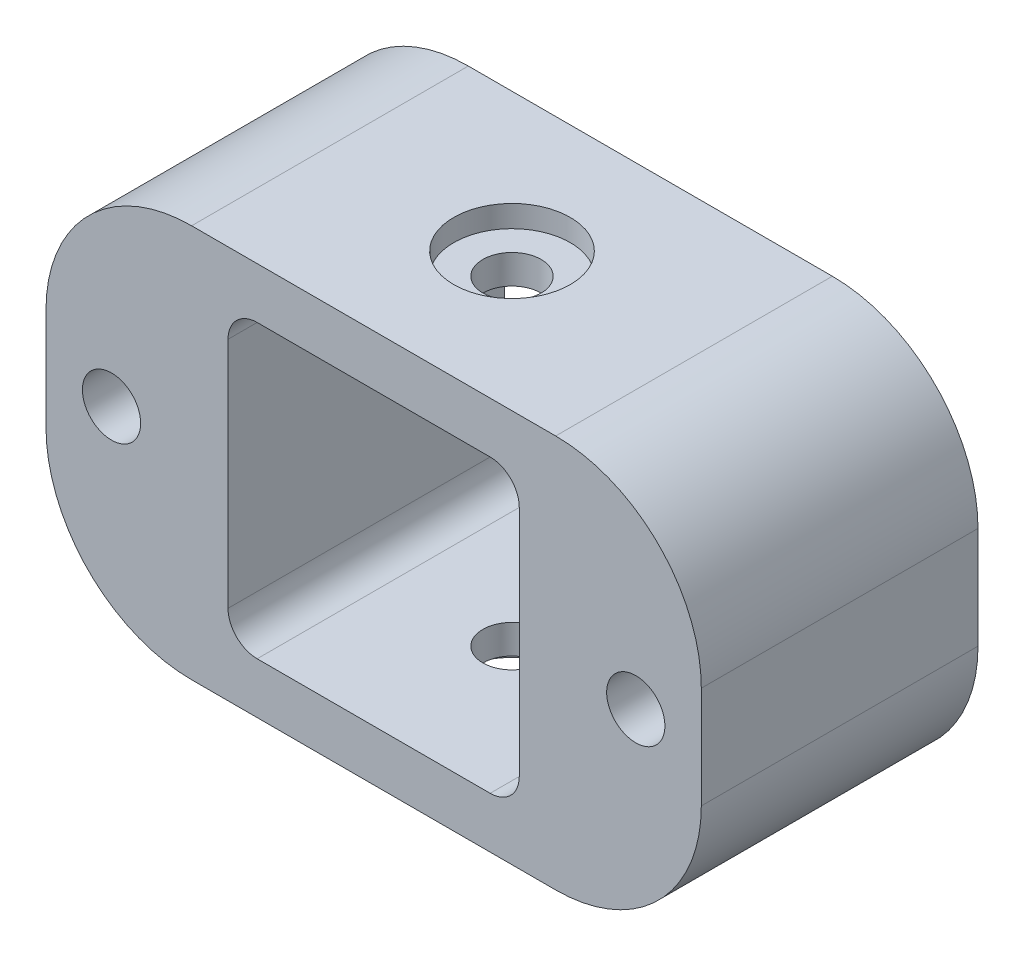
ISO-10303-21;
HEADER;
FILE_DESCRIPTION(('STEP AP214'),'2;1');
FILE_NAME('part.step','',(''),(''),'','','');
FILE_SCHEMA(('AUTOMOTIVE_DESIGN { 1 0 10303 214 1 1 1 1 }'));
ENDSEC;
DATA;
#1=APPLICATION_CONTEXT('core data for automotive mechanical design processes');
#2=APPLICATION_PROTOCOL_DEFINITION('international standard','automotive_design',2000,#1);
#3=PRODUCT_CONTEXT('',#1,'mechanical');
#4=PRODUCT('Part','Part','',(#3));
#5=PRODUCT_RELATED_PRODUCT_CATEGORY('part','',(#4));
#6=PRODUCT_DEFINITION_FORMATION('','',#4);
#7=PRODUCT_DEFINITION_CONTEXT('part definition',#1,'design');
#8=PRODUCT_DEFINITION('design','',#6,#7);
#9=PRODUCT_DEFINITION_SHAPE('','',#8);
#10=(LENGTH_UNIT() NAMED_UNIT(*) SI_UNIT(.MILLI.,.METRE.));
#11=(NAMED_UNIT(*) PLANE_ANGLE_UNIT() SI_UNIT($,.RADIAN.));
#12=(NAMED_UNIT(*) SI_UNIT($,.STERADIAN.) SOLID_ANGLE_UNIT());
#13=UNCERTAINTY_MEASURE_WITH_UNIT(LENGTH_MEASURE(1.E-05),#10,'distance_accuracy_value','');
#14=(GEOMETRIC_REPRESENTATION_CONTEXT(3) GLOBAL_UNCERTAINTY_ASSIGNED_CONTEXT((#13)) GLOBAL_UNIT_ASSIGNED_CONTEXT((#10,
#11,#12)) REPRESENTATION_CONTEXT('',''));
#15=CARTESIAN_POINT('',(0.,0.,0.));
#16=DIRECTION('',(0.,0.,1.));
#17=DIRECTION('',(1.,0.,0.));
#18=AXIS2_PLACEMENT_3D('',#15,#16,#17);
#19=CARTESIAN_POINT('',(0.,-13.5,9.5));
#20=DIRECTION('',(0.,1.,0.));
#21=DIRECTION('',(0.,0.,1.));
#22=AXIS2_PLACEMENT_3D('',#19,#20,#21);
#23=CYLINDRICAL_SURFACE('',#22,2.);
#24=CARTESIAN_POINT('',(0.,-10.,9.5));
#25=DIRECTION('',(0.,1.,0.));
#26=DIRECTION('',(0.,0.,1.));
#27=AXIS2_PLACEMENT_3D('',#24,#25,#26);
#28=CIRCLE('',#27,2.);
#29=CARTESIAN_POINT('',(0.,-10.,11.5));
#30=VERTEX_POINT('',#29);
#31=EDGE_CURVE('E272',#30,#30,#28,.T.);
#32=ORIENTED_EDGE('',*,*,#31,.T.);
#33=EDGE_LOOP('',(#32));
#34=FACE_BOUND('',#33,.T.);
#35=CARTESIAN_POINT('',(0.,-12.,9.5));
#36=DIRECTION('',(0.,-1.,0.));
#37=DIRECTION('',(0.,0.,-1.));
#38=AXIS2_PLACEMENT_3D('',#35,#36,#37);
#39=CIRCLE('',#38,2.);
#40=CARTESIAN_POINT('',(0.,-12.,7.5));
#41=VERTEX_POINT('',#40);
#42=EDGE_CURVE('E37',#41,#41,#39,.F.);
#43=ORIENTED_EDGE('',*,*,#42,.F.);
#44=EDGE_LOOP('',(#43));
#45=FACE_BOUND('',#44,.T.);
#46=ADVANCED_FACE('F33',(#34,#45),#23,.F.);
#47=CARTESIAN_POINT('',(0.,9.99999999999999,9.5));
#48=DIRECTION('',(0.,-1.,0.));
#49=DIRECTION('',(0.,0.,-1.));
#50=AXIS2_PLACEMENT_3D('',#47,#48,#49);
#51=CIRCLE('',#50,2.);
#52=CARTESIAN_POINT('',(0.,9.99999999999999,7.5));
#53=VERTEX_POINT('',#52);
#54=EDGE_CURVE('E270',#53,#53,#51,.T.);
#55=ORIENTED_EDGE('',*,*,#54,.T.);
#56=EDGE_LOOP('',(#55));
#57=FACE_BOUND('',#56,.T.);
#58=CARTESIAN_POINT('',(0.,12.,9.5));
#59=DIRECTION('',(0.,1.,0.));
#60=DIRECTION('',(0.,0.,1.));
#61=AXIS2_PLACEMENT_3D('',#58,#59,#60);
#62=CIRCLE('',#61,2.);
#63=CARTESIAN_POINT('',(0.,12.,11.5));
#64=VERTEX_POINT('',#63);
#65=EDGE_CURVE('E273',#64,#64,#62,.F.);
#66=ORIENTED_EDGE('',*,*,#65,.F.);
#67=EDGE_LOOP('',(#66));
#68=FACE_BOUND('',#67,.T.);
#69=ADVANCED_FACE('F321',(#57,#68),#23,.F.);
#70=CARTESIAN_POINT('',(12.5,3.5,19.));
#71=DIRECTION('',(0.,0.,-1.));
#72=DIRECTION('',(-1.,0.,0.));
#73=AXIS2_PLACEMENT_3D('',#70,#71,#72);
#74=PLANE('',#73);
#75=CARTESIAN_POINT('',(12.5,3.5,19.));
#76=DIRECTION('',(0.,0.,1.));
#77=DIRECTION('',(-1.,0.,0.));
#78=AXIS2_PLACEMENT_3D('',#75,#76,#77);
#79=CIRCLE('',#78,10.);
#80=CARTESIAN_POINT('',(22.5,3.49999999999993,19.));
#81=VERTEX_POINT('',#80);
#82=CARTESIAN_POINT('',(12.4999999999999,13.5,19.));
#83=VERTEX_POINT('',#82);
#84=EDGE_CURVE('E217',#81,#83,#79,.T.);
#85=ORIENTED_EDGE('',*,*,#84,.T.);
#86=DIRECTION('',(-1.,0.,0.));
#87=VECTOR('',#86,1.);
#88=CARTESIAN_POINT('',(-12.4999999999999,13.5,19.));
#89=LINE('',#88,#87);
#90=CARTESIAN_POINT('',(-12.4999999999999,13.5,19.));
#91=VERTEX_POINT('',#90);
#92=EDGE_CURVE('E220',#83,#91,#89,.T.);
#93=ORIENTED_EDGE('',*,*,#92,.T.);
#94=CARTESIAN_POINT('',(-12.5,3.5,19.));
#95=DIRECTION('',(0.,0.,1.));
#96=DIRECTION('',(-1.,0.,0.));
#97=AXIS2_PLACEMENT_3D('',#94,#95,#96);
#98=CIRCLE('',#97,10.);
#99=CARTESIAN_POINT('',(-22.5,3.49999999999993,19.));
#100=VERTEX_POINT('',#99);
#101=EDGE_CURVE('E223',#91,#100,#98,.T.);
#102=ORIENTED_EDGE('',*,*,#101,.T.);
#103=DIRECTION('',(0.,-1.,0.));
#104=VECTOR('',#103,1.);
#105=CARTESIAN_POINT('',(-22.5,-3.49999999999993,19.));
#106=LINE('',#105,#104);
#107=CARTESIAN_POINT('',(-22.5,-3.49999999999993,19.));
#108=VERTEX_POINT('',#107);
#109=EDGE_CURVE('E225',#100,#108,#106,.T.);
#110=ORIENTED_EDGE('',*,*,#109,.T.);
#111=CARTESIAN_POINT('',(-12.5,-3.5,19.));
#112=DIRECTION('',(0.,0.,1.));
#113=DIRECTION('',(-1.,0.,0.));
#114=AXIS2_PLACEMENT_3D('',#111,#112,#113);
#115=CIRCLE('',#114,10.);
#116=CARTESIAN_POINT('',(-12.4999999999999,-13.5,19.));
#117=VERTEX_POINT('',#116);
#118=EDGE_CURVE('E227',#108,#117,#115,.T.);
#119=ORIENTED_EDGE('',*,*,#118,.T.);
#120=DIRECTION('',(1.,0.,0.));
#121=VECTOR('',#120,1.);
#122=CARTESIAN_POINT('',(-12.4999999999999,-13.5,19.));
#123=LINE('',#122,#121);
#124=CARTESIAN_POINT('',(12.4999999999999,-13.5,19.));
#125=VERTEX_POINT('',#124);
#126=EDGE_CURVE('E229',#117,#125,#123,.T.);
#127=ORIENTED_EDGE('',*,*,#126,.T.);
#128=CARTESIAN_POINT('',(12.5,-3.5,19.));
#129=DIRECTION('',(0.,0.,1.));
#130=DIRECTION('',(-1.,0.,0.));
#131=AXIS2_PLACEMENT_3D('',#128,#129,#130);
#132=CIRCLE('',#131,10.);
#133=CARTESIAN_POINT('',(22.5,-3.49999999999993,19.));
#134=VERTEX_POINT('',#133);
#135=EDGE_CURVE('E231',#125,#134,#132,.T.);
#136=ORIENTED_EDGE('',*,*,#135,.T.);
#137=DIRECTION('',(0.,1.,0.));
#138=VECTOR('',#137,1.);
#139=CARTESIAN_POINT('',(22.5,-3.49999999999993,19.));
#140=LINE('',#139,#138);
#141=EDGE_CURVE('E233',#134,#81,#140,.T.);
#142=ORIENTED_EDGE('',*,*,#141,.T.);
#143=EDGE_LOOP('',(#85,#93,#102,#110,#119,#127,#136,#142));
#144=FACE_BOUND('',#143,.T.);
#145=CARTESIAN_POINT('',(-8.,-8.00000000000001,19.));
#146=DIRECTION('',(0.,0.,1.));
#147=DIRECTION('',(1.,0.,0.));
#148=AXIS2_PLACEMENT_3D('',#145,#146,#147);
#149=CIRCLE('',#148,2.);
#150=CARTESIAN_POINT('',(-10.,-8.00000000000001,19.));
#151=VERTEX_POINT('',#150);
#152=CARTESIAN_POINT('',(-8.,-10.,19.));
#153=VERTEX_POINT('',#152);
#154=EDGE_CURVE('E148',#151,#153,#149,.T.);
#155=ORIENTED_EDGE('',*,*,#154,.F.);
#156=DIRECTION('',(0.,-1.,0.));
#157=VECTOR('',#156,1.);
#158=CARTESIAN_POINT('',(-10.,-8.00000000000001,19.));
#159=LINE('',#158,#157);
#160=CARTESIAN_POINT('',(-10.,7.99999999999999,19.));
#161=VERTEX_POINT('',#160);
#162=EDGE_CURVE('E184',#161,#151,#159,.T.);
#163=ORIENTED_EDGE('',*,*,#162,.F.);
#164=CARTESIAN_POINT('',(-8.,7.99999999999999,19.));
#165=DIRECTION('',(0.,0.,1.));
#166=DIRECTION('',(1.,0.,0.));
#167=AXIS2_PLACEMENT_3D('',#164,#165,#166);
#168=CIRCLE('',#167,2.);
#169=CARTESIAN_POINT('',(-8.,9.99999999999999,19.));
#170=VERTEX_POINT('',#169);
#171=EDGE_CURVE('E182',#170,#161,#168,.T.);
#172=ORIENTED_EDGE('',*,*,#171,.F.);
#173=DIRECTION('',(-1.,0.,0.));
#174=VECTOR('',#173,1.);
#175=CARTESIAN_POINT('',(-8.,9.99999999999999,19.));
#176=LINE('',#175,#174);
#177=CARTESIAN_POINT('',(8.,9.99999999999999,19.));
#178=VERTEX_POINT('',#177);
#179=EDGE_CURVE('E180',#178,#170,#176,.T.);
#180=ORIENTED_EDGE('',*,*,#179,.F.);
#181=CARTESIAN_POINT('',(8.,7.99999999999999,19.));
#182=DIRECTION('',(0.,0.,1.));
#183=DIRECTION('',(1.,0.,0.));
#184=AXIS2_PLACEMENT_3D('',#181,#182,#183);
#185=CIRCLE('',#184,2.);
#186=CARTESIAN_POINT('',(10.,7.99999999999999,19.));
#187=VERTEX_POINT('',#186);
#188=EDGE_CURVE('E178',#187,#178,#185,.T.);
#189=ORIENTED_EDGE('',*,*,#188,.F.);
#190=DIRECTION('',(0.,1.,0.));
#191=VECTOR('',#190,1.);
#192=CARTESIAN_POINT('',(10.,-8.00000000000001,19.));
#193=LINE('',#192,#191);
#194=CARTESIAN_POINT('',(10.,-8.00000000000001,19.));
#195=VERTEX_POINT('',#194);
#196=EDGE_CURVE('E173',#195,#187,#193,.T.);
#197=ORIENTED_EDGE('',*,*,#196,.F.);
#198=CARTESIAN_POINT('',(8.,-8.00000000000001,19.));
#199=DIRECTION('',(0.,0.,1.));
#200=DIRECTION('',(1.,0.,0.));
#201=AXIS2_PLACEMENT_3D('',#198,#199,#200);
#202=CIRCLE('',#201,2.);
#203=CARTESIAN_POINT('',(8.,-10.,19.));
#204=VERTEX_POINT('',#203);
#205=EDGE_CURVE('E171',#204,#195,#202,.T.);
#206=ORIENTED_EDGE('',*,*,#205,.F.);
#207=DIRECTION('',(1.,0.,0.));
#208=VECTOR('',#207,1.);
#209=CARTESIAN_POINT('',(-8.,-10.,19.));
#210=LINE('',#209,#208);
#211=EDGE_CURVE('E156',#153,#204,#210,.T.);
#212=ORIENTED_EDGE('',*,*,#211,.F.);
#213=EDGE_LOOP('',(#155,#163,#172,#180,#189,#197,#206,#212));
#214=FACE_BOUND('',#213,.T.);
#215=CARTESIAN_POINT('',(-18.,0.,19.));
#216=DIRECTION('',(0.,0.,1.));
#217=DIRECTION('',(1.,0.,0.));
#218=AXIS2_PLACEMENT_3D('',#215,#216,#217);
#219=CIRCLE('',#218,2.);
#220=CARTESIAN_POINT('',(-16.,0.,19.));
#221=VERTEX_POINT('',#220);
#222=EDGE_CURVE('E187',#221,#221,#219,.T.);
#223=ORIENTED_EDGE('',*,*,#222,.F.);
#224=EDGE_LOOP('',(#223));
#225=FACE_BOUND('',#224,.T.);
#226=CARTESIAN_POINT('',(18.,0.,19.));
#227=DIRECTION('',(0.,0.,1.));
#228=DIRECTION('',(1.,0.,0.));
#229=AXIS2_PLACEMENT_3D('',#226,#227,#228);
#230=CIRCLE('',#229,2.);
#231=CARTESIAN_POINT('',(20.,0.,19.));
#232=VERTEX_POINT('',#231);
#233=EDGE_CURVE('E292',#232,#232,#230,.T.);
#234=ORIENTED_EDGE('',*,*,#233,.F.);
#235=EDGE_LOOP('',(#234));
#236=FACE_BOUND('',#235,.T.);
#237=ADVANCED_FACE('F168',(#144,#214,#225,#236),#74,.F.);
#238=CARTESIAN_POINT('',(12.5,3.5,0.));
#239=DIRECTION('',(0.,0.,-1.));
#240=DIRECTION('',(-1.,0.,0.));
#241=AXIS2_PLACEMENT_3D('',#238,#239,#240);
#242=PLANE('',#241);
#243=CARTESIAN_POINT('',(-18.,0.,0.));
#244=DIRECTION('',(0.,0.,1.));
#245=DIRECTION('',(1.,0.,0.));
#246=AXIS2_PLACEMENT_3D('',#243,#244,#245);
#247=CIRCLE('',#246,2.);
#248=CARTESIAN_POINT('',(-16.,0.,0.));
#249=VERTEX_POINT('',#248);
#250=EDGE_CURVE('E295',#249,#249,#247,.T.);
#251=ORIENTED_EDGE('',*,*,#250,.T.);
#252=EDGE_LOOP('',(#251));
#253=FACE_BOUND('',#252,.T.);
#254=CARTESIAN_POINT('',(12.5,3.5,0.));
#255=DIRECTION('',(0.,0.,1.));
#256=DIRECTION('',(-1.,0.,0.));
#257=AXIS2_PLACEMENT_3D('',#254,#255,#256);
#258=CIRCLE('',#257,10.);
#259=CARTESIAN_POINT('',(22.5,3.49999999999993,0.));
#260=VERTEX_POINT('',#259);
#261=CARTESIAN_POINT('',(12.4999999999999,13.5,0.));
#262=VERTEX_POINT('',#261);
#263=EDGE_CURVE('E164',#260,#262,#258,.T.);
#264=ORIENTED_EDGE('',*,*,#263,.F.);
#265=DIRECTION('',(0.,1.,0.));
#266=VECTOR('',#265,1.);
#267=CARTESIAN_POINT('',(22.5,-3.49999999999993,0.));
#268=LINE('',#267,#266);
#269=CARTESIAN_POINT('',(22.5,-3.49999999999993,0.));
#270=VERTEX_POINT('',#269);
#271=EDGE_CURVE('E221',#270,#260,#268,.T.);
#272=ORIENTED_EDGE('',*,*,#271,.F.);
#273=CARTESIAN_POINT('',(12.5,-3.5,0.));
#274=DIRECTION('',(0.,0.,1.));
#275=DIRECTION('',(-1.,0.,0.));
#276=AXIS2_PLACEMENT_3D('',#273,#274,#275);
#277=CIRCLE('',#276,10.);
#278=CARTESIAN_POINT('',(12.4999999999999,-13.5,0.));
#279=VERTEX_POINT('',#278);
#280=EDGE_CURVE('E248',#279,#270,#277,.T.);
#281=ORIENTED_EDGE('',*,*,#280,.F.);
#282=DIRECTION('',(1.,0.,0.));
#283=VECTOR('',#282,1.);
#284=CARTESIAN_POINT('',(-12.4999999999999,-13.5,0.));
#285=LINE('',#284,#283);
#286=CARTESIAN_POINT('',(-12.4999999999999,-13.5,0.));
#287=VERTEX_POINT('',#286);
#288=EDGE_CURVE('E246',#287,#279,#285,.T.);
#289=ORIENTED_EDGE('',*,*,#288,.F.);
#290=CARTESIAN_POINT('',(-12.5,-3.5,0.));
#291=DIRECTION('',(0.,0.,1.));
#292=DIRECTION('',(-1.,0.,0.));
#293=AXIS2_PLACEMENT_3D('',#290,#291,#292);
#294=CIRCLE('',#293,10.);
#295=CARTESIAN_POINT('',(-22.5,-3.49999999999993,0.));
#296=VERTEX_POINT('',#295);
#297=EDGE_CURVE('E244',#296,#287,#294,.T.);
#298=ORIENTED_EDGE('',*,*,#297,.F.);
#299=DIRECTION('',(0.,-1.,0.));
#300=VECTOR('',#299,1.);
#301=CARTESIAN_POINT('',(-22.5,-3.49999999999993,0.));
#302=LINE('',#301,#300);
#303=CARTESIAN_POINT('',(-22.5,3.49999999999993,0.));
#304=VERTEX_POINT('',#303);
#305=EDGE_CURVE('E242',#304,#296,#302,.T.);
#306=ORIENTED_EDGE('',*,*,#305,.F.);
#307=CARTESIAN_POINT('',(-12.5,3.5,0.));
#308=DIRECTION('',(0.,0.,1.));
#309=DIRECTION('',(-1.,0.,0.));
#310=AXIS2_PLACEMENT_3D('',#307,#308,#309);
#311=CIRCLE('',#310,10.);
#312=CARTESIAN_POINT('',(-12.4999999999999,13.5,0.));
#313=VERTEX_POINT('',#312);
#314=EDGE_CURVE('E240',#313,#304,#311,.T.);
#315=ORIENTED_EDGE('',*,*,#314,.F.);
#316=DIRECTION('',(-1.,0.,0.));
#317=VECTOR('',#316,1.);
#318=CARTESIAN_POINT('',(-12.4999999999999,13.5,0.));
#319=LINE('',#318,#317);
#320=EDGE_CURVE('E238',#262,#313,#319,.T.);
#321=ORIENTED_EDGE('',*,*,#320,.F.);
#322=EDGE_LOOP('',(#264,#272,#281,#289,#298,#306,#315,#321));
#323=FACE_BOUND('',#322,.T.);
#324=DIRECTION('',(0.,-1.,0.));
#325=VECTOR('',#324,1.);
#326=CARTESIAN_POINT('',(-10.,-8.00000000000001,0.));
#327=LINE('',#326,#325);
#328=CARTESIAN_POINT('',(-10.,7.99999999999999,0.));
#329=VERTEX_POINT('',#328);
#330=CARTESIAN_POINT('',(-10.,-8.00000000000001,0.));
#331=VERTEX_POINT('',#330);
#332=EDGE_CURVE('E157',#329,#331,#327,.T.);
#333=ORIENTED_EDGE('',*,*,#332,.T.);
#334=CARTESIAN_POINT('',(-8.,-8.00000000000001,0.));
#335=DIRECTION('',(0.,0.,1.));
#336=DIRECTION('',(1.,0.,0.));
#337=AXIS2_PLACEMENT_3D('',#334,#335,#336);
#338=CIRCLE('',#337,2.);
#339=CARTESIAN_POINT('',(-8.,-10.,0.));
#340=VERTEX_POINT('',#339);
#341=EDGE_CURVE('E58',#331,#340,#338,.T.);
#342=ORIENTED_EDGE('',*,*,#341,.T.);
#343=DIRECTION('',(1.,0.,0.));
#344=VECTOR('',#343,1.);
#345=CARTESIAN_POINT('',(-8.,-10.,0.));
#346=LINE('',#345,#344);
#347=CARTESIAN_POINT('',(8.,-10.,0.));
#348=VERTEX_POINT('',#347);
#349=EDGE_CURVE('E163',#340,#348,#346,.T.);
#350=ORIENTED_EDGE('',*,*,#349,.T.);
#351=CARTESIAN_POINT('',(8.,-8.00000000000001,0.));
#352=DIRECTION('',(0.,0.,1.));
#353=DIRECTION('',(1.,0.,0.));
#354=AXIS2_PLACEMENT_3D('',#351,#352,#353);
#355=CIRCLE('',#354,2.);
#356=CARTESIAN_POINT('',(10.,-8.00000000000001,0.));
#357=VERTEX_POINT('',#356);
#358=EDGE_CURVE('E189',#348,#357,#355,.T.);
#359=ORIENTED_EDGE('',*,*,#358,.T.);
#360=DIRECTION('',(0.,1.,0.));
#361=VECTOR('',#360,1.);
#362=CARTESIAN_POINT('',(10.,-8.00000000000001,0.));
#363=LINE('',#362,#361);
#364=CARTESIAN_POINT('',(10.,7.99999999999999,0.));
#365=VERTEX_POINT('',#364);
#366=EDGE_CURVE('E192',#357,#365,#363,.T.);
#367=ORIENTED_EDGE('',*,*,#366,.T.);
#368=CARTESIAN_POINT('',(8.,7.99999999999999,0.));
#369=DIRECTION('',(0.,0.,1.));
#370=DIRECTION('',(1.,0.,0.));
#371=AXIS2_PLACEMENT_3D('',#368,#369,#370);
#372=CIRCLE('',#371,2.);
#373=CARTESIAN_POINT('',(8.,9.99999999999999,0.));
#374=VERTEX_POINT('',#373);
#375=EDGE_CURVE('E195',#365,#374,#372,.T.);
#376=ORIENTED_EDGE('',*,*,#375,.T.);
#377=DIRECTION('',(-1.,0.,0.));
#378=VECTOR('',#377,1.);
#379=CARTESIAN_POINT('',(-8.,9.99999999999999,0.));
#380=LINE('',#379,#378);
#381=CARTESIAN_POINT('',(-8.,9.99999999999999,0.));
#382=VERTEX_POINT('',#381);
#383=EDGE_CURVE('E198',#374,#382,#380,.T.);
#384=ORIENTED_EDGE('',*,*,#383,.T.);
#385=CARTESIAN_POINT('',(-8.,7.99999999999999,0.));
#386=DIRECTION('',(0.,0.,1.));
#387=DIRECTION('',(1.,0.,0.));
#388=AXIS2_PLACEMENT_3D('',#385,#386,#387);
#389=CIRCLE('',#388,2.);
#390=EDGE_CURVE('E201',#382,#329,#389,.T.);
#391=ORIENTED_EDGE('',*,*,#390,.T.);
#392=EDGE_LOOP('',(#333,#342,#350,#359,#367,#376,#384,#391));
#393=FACE_BOUND('',#392,.T.);
#394=CARTESIAN_POINT('',(18.,0.,0.));
#395=DIRECTION('',(0.,0.,1.));
#396=DIRECTION('',(1.,0.,0.));
#397=AXIS2_PLACEMENT_3D('',#394,#395,#396);
#398=CIRCLE('',#397,2.);
#399=CARTESIAN_POINT('',(20.,0.,0.));
#400=VERTEX_POINT('',#399);
#401=EDGE_CURVE('E291',#400,#400,#398,.T.);
#402=ORIENTED_EDGE('',*,*,#401,.T.);
#403=EDGE_LOOP('',(#402));
#404=FACE_BOUND('',#403,.T.);
#405=ADVANCED_FACE('F302',(#253,#323,#393,#404),#242,.T.);
#406=CARTESIAN_POINT('',(12.5,3.5,19.));
#407=DIRECTION('',(0.,0.,-1.));
#408=DIRECTION('',(-1.,0.,0.));
#409=AXIS2_PLACEMENT_3D('',#406,#407,#408);
#410=CYLINDRICAL_SURFACE('',#409,10.);
#411=ORIENTED_EDGE('',*,*,#263,.T.);
#412=DIRECTION('',(0.,0.,-1.));
#413=VECTOR('',#412,1.);
#414=CARTESIAN_POINT('',(12.4999999999999,13.5,19.));
#415=LINE('',#414,#413);
#416=EDGE_CURVE('E11',#83,#262,#415,.T.);
#417=ORIENTED_EDGE('',*,*,#416,.F.);
#418=ORIENTED_EDGE('',*,*,#84,.F.);
#419=DIRECTION('',(0.,0.,-1.));
#420=VECTOR('',#419,1.);
#421=CARTESIAN_POINT('',(22.5,3.49999999999993,19.));
#422=LINE('',#421,#420);
#423=EDGE_CURVE('E235',#81,#260,#422,.T.);
#424=ORIENTED_EDGE('',*,*,#423,.T.);
#425=EDGE_LOOP('',(#411,#417,#418,#424));
#426=FACE_BOUND('',#425,.T.);
#427=ADVANCED_FACE('F35',(#426),#410,.T.);
#428=CARTESIAN_POINT('',(-12.4999999999999,13.5,19.));
#429=DIRECTION('',(0.,-1.,0.));
#430=DIRECTION('',(0.,0.,-1.));
#431=AXIS2_PLACEMENT_3D('',#428,#429,#430);
#432=PLANE('',#431);
#433=CARTESIAN_POINT('',(0.,13.5,9.5));
#434=DIRECTION('',(0.,1.,0.));
#435=DIRECTION('',(0.,0.,1.));
#436=AXIS2_PLACEMENT_3D('',#433,#434,#435);
#437=CIRCLE('',#436,4.);
#438=CARTESIAN_POINT('',(0.,13.5,13.5));
#439=VERTEX_POINT('',#438);
#440=EDGE_CURVE('E279',#439,#439,#437,.T.);
#441=ORIENTED_EDGE('',*,*,#440,.F.);
#442=EDGE_LOOP('',(#441));
#443=FACE_BOUND('',#442,.T.);
#444=ORIENTED_EDGE('',*,*,#320,.T.);
#445=DIRECTION('',(0.,0.,-1.));
#446=VECTOR('',#445,1.);
#447=CARTESIAN_POINT('',(-12.4999999999999,13.5,19.));
#448=LINE('',#447,#446);
#449=EDGE_CURVE('E42',#91,#313,#448,.T.);
#450=ORIENTED_EDGE('',*,*,#449,.F.);
#451=ORIENTED_EDGE('',*,*,#92,.F.);
#452=ORIENTED_EDGE('',*,*,#416,.T.);
#453=EDGE_LOOP('',(#444,#450,#451,#452));
#454=FACE_BOUND('',#453,.T.);
#455=ADVANCED_FACE('F395',(#443,#454),#432,.F.);
#456=CARTESIAN_POINT('',(-12.5,3.5,19.));
#457=DIRECTION('',(0.,0.,-1.));
#458=DIRECTION('',(-1.,0.,0.));
#459=AXIS2_PLACEMENT_3D('',#456,#457,#458);
#460=CYLINDRICAL_SURFACE('',#459,10.);
#461=ORIENTED_EDGE('',*,*,#314,.T.);
#462=DIRECTION('',(0.,0.,-1.));
#463=VECTOR('',#462,1.);
#464=CARTESIAN_POINT('',(-22.5,3.49999999999993,19.));
#465=LINE('',#464,#463);
#466=EDGE_CURVE('E265',#100,#304,#465,.T.);
#467=ORIENTED_EDGE('',*,*,#466,.F.);
#468=ORIENTED_EDGE('',*,*,#101,.F.);
#469=ORIENTED_EDGE('',*,*,#449,.T.);
#470=EDGE_LOOP('',(#461,#467,#468,#469));
#471=FACE_BOUND('',#470,.T.);
#472=ADVANCED_FACE('F393',(#471),#460,.T.);
#473=CARTESIAN_POINT('',(-22.5,-3.49999999999993,19.));
#474=DIRECTION('',(1.,0.,0.));
#475=DIRECTION('',(0.,0.,-1.));
#476=AXIS2_PLACEMENT_3D('',#473,#474,#475);
#477=PLANE('',#476);
#478=ORIENTED_EDGE('',*,*,#305,.T.);
#479=DIRECTION('',(0.,0.,-1.));
#480=VECTOR('',#479,1.);
#481=CARTESIAN_POINT('',(-22.5,-3.49999999999993,19.));
#482=LINE('',#481,#480);
#483=EDGE_CURVE('E262',#108,#296,#482,.T.);
#484=ORIENTED_EDGE('',*,*,#483,.F.);
#485=ORIENTED_EDGE('',*,*,#109,.F.);
#486=ORIENTED_EDGE('',*,*,#466,.T.);
#487=EDGE_LOOP('',(#478,#484,#485,#486));
#488=FACE_BOUND('',#487,.T.);
#489=ADVANCED_FACE('F389',(#488),#477,.F.);
#490=CARTESIAN_POINT('',(-12.5,-3.5,19.));
#491=DIRECTION('',(0.,0.,-1.));
#492=DIRECTION('',(-1.,0.,0.));
#493=AXIS2_PLACEMENT_3D('',#490,#491,#492);
#494=CYLINDRICAL_SURFACE('',#493,10.);
#495=ORIENTED_EDGE('',*,*,#297,.T.);
#496=DIRECTION('',(0.,0.,-1.));
#497=VECTOR('',#496,1.);
#498=CARTESIAN_POINT('',(-12.4999999999999,-13.5,19.));
#499=LINE('',#498,#497);
#500=EDGE_CURVE('E259',#117,#287,#499,.T.);
#501=ORIENTED_EDGE('',*,*,#500,.F.);
#502=ORIENTED_EDGE('',*,*,#118,.F.);
#503=ORIENTED_EDGE('',*,*,#483,.T.);
#504=EDGE_LOOP('',(#495,#501,#502,#503));
#505=FACE_BOUND('',#504,.T.);
#506=ADVANCED_FACE('F359',(#505),#494,.T.);
#507=CARTESIAN_POINT('',(-12.4999999999999,-13.5,19.));
#508=DIRECTION('',(0.,1.,0.));
#509=DIRECTION('',(0.,0.,1.));
#510=AXIS2_PLACEMENT_3D('',#507,#508,#509);
#511=PLANE('',#510);
#512=CARTESIAN_POINT('',(0.,-13.5,9.5));
#513=DIRECTION('',(0.,-1.,0.));
#514=DIRECTION('',(0.,0.,-1.));
#515=AXIS2_PLACEMENT_3D('',#512,#513,#514);
#516=CIRCLE('',#515,4.);
#517=CARTESIAN_POINT('',(0.,-13.5,5.5));
#518=VERTEX_POINT('',#517);
#519=EDGE_CURVE('E286',#518,#518,#516,.T.);
#520=ORIENTED_EDGE('',*,*,#519,.F.);
#521=EDGE_LOOP('',(#520));
#522=FACE_BOUND('',#521,.T.);
#523=ORIENTED_EDGE('',*,*,#288,.T.);
#524=DIRECTION('',(0.,0.,-1.));
#525=VECTOR('',#524,1.);
#526=CARTESIAN_POINT('',(12.4999999999999,-13.5,19.));
#527=LINE('',#526,#525);
#528=EDGE_CURVE('E256',#125,#279,#527,.T.);
#529=ORIENTED_EDGE('',*,*,#528,.F.);
#530=ORIENTED_EDGE('',*,*,#126,.F.);
#531=ORIENTED_EDGE('',*,*,#500,.T.);
#532=EDGE_LOOP('',(#523,#529,#530,#531));
#533=FACE_BOUND('',#532,.T.);
#534=ADVANCED_FACE('F355',(#522,#533),#511,.F.);
#535=CARTESIAN_POINT('',(12.5,-3.5,19.));
#536=DIRECTION('',(0.,0.,-1.));
#537=DIRECTION('',(-1.,0.,0.));
#538=AXIS2_PLACEMENT_3D('',#535,#536,#537);
#539=CYLINDRICAL_SURFACE('',#538,10.);
#540=ORIENTED_EDGE('',*,*,#280,.T.);
#541=DIRECTION('',(0.,0.,-1.));
#542=VECTOR('',#541,1.);
#543=CARTESIAN_POINT('',(22.5,-3.49999999999993,19.));
#544=LINE('',#543,#542);
#545=EDGE_CURVE('E253',#134,#270,#544,.T.);
#546=ORIENTED_EDGE('',*,*,#545,.F.);
#547=ORIENTED_EDGE('',*,*,#135,.F.);
#548=ORIENTED_EDGE('',*,*,#528,.T.);
#549=EDGE_LOOP('',(#540,#546,#547,#548));
#550=FACE_BOUND('',#549,.T.);
#551=ADVANCED_FACE('F358',(#550),#539,.T.);
#552=CARTESIAN_POINT('',(22.5,-3.49999999999993,19.));
#553=DIRECTION('',(-1.,0.,0.));
#554=DIRECTION('',(0.,0.,1.));
#555=AXIS2_PLACEMENT_3D('',#552,#553,#554);
#556=PLANE('',#555);
#557=ORIENTED_EDGE('',*,*,#271,.T.);
#558=ORIENTED_EDGE('',*,*,#423,.F.);
#559=ORIENTED_EDGE('',*,*,#141,.F.);
#560=ORIENTED_EDGE('',*,*,#545,.T.);
#561=EDGE_LOOP('',(#557,#558,#559,#560));
#562=FACE_BOUND('',#561,.T.);
#563=ADVANCED_FACE('F375',(#562),#556,.F.);
#564=CARTESIAN_POINT('',(-8.,-8.00000000000001,19.));
#565=DIRECTION('',(0.,0.,-1.));
#566=DIRECTION('',(-1.,0.,0.));
#567=AXIS2_PLACEMENT_3D('',#564,#565,#566);
#568=CYLINDRICAL_SURFACE('',#567,2.);
#569=ORIENTED_EDGE('',*,*,#341,.F.);
#570=DIRECTION('',(0.,0.,-1.));
#571=VECTOR('',#570,1.);
#572=CARTESIAN_POINT('',(-10.,-8.00000000000001,19.));
#573=LINE('',#572,#571);
#574=EDGE_CURVE('E152',#151,#331,#573,.T.);
#575=ORIENTED_EDGE('',*,*,#574,.F.);
#576=ORIENTED_EDGE('',*,*,#154,.T.);
#577=DIRECTION('',(0.,0.,-1.));
#578=VECTOR('',#577,1.);
#579=CARTESIAN_POINT('',(-8.,-10.,19.));
#580=LINE('',#579,#578);
#581=EDGE_CURVE('E151',#153,#340,#580,.T.);
#582=ORIENTED_EDGE('',*,*,#581,.T.);
#583=EDGE_LOOP('',(#569,#575,#576,#582));
#584=FACE_BOUND('',#583,.T.);
#585=ADVANCED_FACE('F150',(#584),#568,.F.);
#586=CARTESIAN_POINT('',(-8.,-10.,19.));
#587=DIRECTION('',(0.,1.,0.));
#588=DIRECTION('',(0.,0.,1.));
#589=AXIS2_PLACEMENT_3D('',#586,#587,#588);
#590=PLANE('',#589);
#591=ORIENTED_EDGE('',*,*,#31,.F.);
#592=EDGE_LOOP('',(#591));
#593=FACE_BOUND('',#592,.T.);
#594=ORIENTED_EDGE('',*,*,#349,.F.);
#595=ORIENTED_EDGE('',*,*,#581,.F.);
#596=ORIENTED_EDGE('',*,*,#211,.T.);
#597=DIRECTION('',(0.,0.,-1.));
#598=VECTOR('',#597,1.);
#599=CARTESIAN_POINT('',(8.,-10.,19.));
#600=LINE('',#599,#598);
#601=EDGE_CURVE('E165',#204,#348,#600,.T.);
#602=ORIENTED_EDGE('',*,*,#601,.T.);
#603=EDGE_LOOP('',(#594,#595,#596,#602));
#604=FACE_BOUND('',#603,.T.);
#605=ADVANCED_FACE('F160',(#593,#604),#590,.T.);
#606=CARTESIAN_POINT('',(8.,-8.00000000000001,19.));
#607=DIRECTION('',(0.,0.,-1.));
#608=DIRECTION('',(-1.,0.,0.));
#609=AXIS2_PLACEMENT_3D('',#606,#607,#608);
#610=CYLINDRICAL_SURFACE('',#609,2.);
#611=ORIENTED_EDGE('',*,*,#358,.F.);
#612=ORIENTED_EDGE('',*,*,#601,.F.);
#613=ORIENTED_EDGE('',*,*,#205,.T.);
#614=DIRECTION('',(0.,0.,-1.));
#615=VECTOR('',#614,1.);
#616=CARTESIAN_POINT('',(10.,-8.00000000000001,19.));
#617=LINE('',#616,#615);
#618=EDGE_CURVE('E214',#195,#357,#617,.T.);
#619=ORIENTED_EDGE('',*,*,#618,.T.);
#620=EDGE_LOOP('',(#611,#612,#613,#619));
#621=FACE_BOUND('',#620,.T.);
#622=ADVANCED_FACE('F421',(#621),#610,.F.);
#623=CARTESIAN_POINT('',(10.,-8.00000000000001,19.));
#624=DIRECTION('',(-1.,0.,0.));
#625=DIRECTION('',(0.,0.,1.));
#626=AXIS2_PLACEMENT_3D('',#623,#624,#625);
#627=PLANE('',#626);
#628=ORIENTED_EDGE('',*,*,#366,.F.);
#629=ORIENTED_EDGE('',*,*,#618,.F.);
#630=ORIENTED_EDGE('',*,*,#196,.T.);
#631=DIRECTION('',(0.,0.,-1.));
#632=VECTOR('',#631,1.);
#633=CARTESIAN_POINT('',(10.,7.99999999999999,19.));
#634=LINE('',#633,#632);
#635=EDGE_CURVE('E212',#187,#365,#634,.T.);
#636=ORIENTED_EDGE('',*,*,#635,.T.);
#637=EDGE_LOOP('',(#628,#629,#630,#636));
#638=FACE_BOUND('',#637,.T.);
#639=ADVANCED_FACE('F425',(#638),#627,.T.);
#640=CARTESIAN_POINT('',(8.,7.99999999999999,19.));
#641=DIRECTION('',(0.,0.,-1.));
#642=DIRECTION('',(-1.,0.,0.));
#643=AXIS2_PLACEMENT_3D('',#640,#641,#642);
#644=CYLINDRICAL_SURFACE('',#643,2.);
#645=ORIENTED_EDGE('',*,*,#375,.F.);
#646=ORIENTED_EDGE('',*,*,#635,.F.);
#647=ORIENTED_EDGE('',*,*,#188,.T.);
#648=DIRECTION('',(0.,0.,-1.));
#649=VECTOR('',#648,1.);
#650=CARTESIAN_POINT('',(8.,9.99999999999999,19.));
#651=LINE('',#650,#649);
#652=EDGE_CURVE('E210',#178,#374,#651,.T.);
#653=ORIENTED_EDGE('',*,*,#652,.T.);
#654=EDGE_LOOP('',(#645,#646,#647,#653));
#655=FACE_BOUND('',#654,.T.);
#656=ADVANCED_FACE('F429',(#655),#644,.F.);
#657=CARTESIAN_POINT('',(-8.,9.99999999999999,19.));
#658=DIRECTION('',(0.,-1.,0.));
#659=DIRECTION('',(0.,0.,-1.));
#660=AXIS2_PLACEMENT_3D('',#657,#658,#659);
#661=PLANE('',#660);
#662=ORIENTED_EDGE('',*,*,#54,.F.);
#663=EDGE_LOOP('',(#662));
#664=FACE_BOUND('',#663,.T.);
#665=ORIENTED_EDGE('',*,*,#383,.F.);
#666=ORIENTED_EDGE('',*,*,#652,.F.);
#667=ORIENTED_EDGE('',*,*,#179,.T.);
#668=DIRECTION('',(0.,0.,-1.));
#669=VECTOR('',#668,1.);
#670=CARTESIAN_POINT('',(-8.,9.99999999999999,19.));
#671=LINE('',#670,#669);
#672=EDGE_CURVE('E208',#170,#382,#671,.T.);
#673=ORIENTED_EDGE('',*,*,#672,.T.);
#674=EDGE_LOOP('',(#665,#666,#667,#673));
#675=FACE_BOUND('',#674,.T.);
#676=ADVANCED_FACE('F433',(#664,#675),#661,.T.);
#677=CARTESIAN_POINT('',(-8.,7.99999999999999,19.));
#678=DIRECTION('',(0.,0.,-1.));
#679=DIRECTION('',(-1.,0.,0.));
#680=AXIS2_PLACEMENT_3D('',#677,#678,#679);
#681=CYLINDRICAL_SURFACE('',#680,2.);
#682=ORIENTED_EDGE('',*,*,#390,.F.);
#683=ORIENTED_EDGE('',*,*,#672,.F.);
#684=ORIENTED_EDGE('',*,*,#171,.T.);
#685=DIRECTION('',(0.,0.,-1.));
#686=VECTOR('',#685,1.);
#687=CARTESIAN_POINT('',(-10.,7.99999999999999,19.));
#688=LINE('',#687,#686);
#689=EDGE_CURVE('E50',#161,#329,#688,.T.);
#690=ORIENTED_EDGE('',*,*,#689,.T.);
#691=EDGE_LOOP('',(#682,#683,#684,#690));
#692=FACE_BOUND('',#691,.T.);
#693=ADVANCED_FACE('F318',(#692),#681,.F.);
#694=CARTESIAN_POINT('',(-10.,-8.00000000000001,19.));
#695=DIRECTION('',(1.,0.,0.));
#696=DIRECTION('',(0.,0.,-1.));
#697=AXIS2_PLACEMENT_3D('',#694,#695,#696);
#698=PLANE('',#697);
#699=ORIENTED_EDGE('',*,*,#332,.F.);
#700=ORIENTED_EDGE('',*,*,#689,.F.);
#701=ORIENTED_EDGE('',*,*,#162,.T.);
#702=ORIENTED_EDGE('',*,*,#574,.T.);
#703=EDGE_LOOP('',(#699,#700,#701,#702));
#704=FACE_BOUND('',#703,.T.);
#705=ADVANCED_FACE('F308',(#704),#698,.T.);
#706=CARTESIAN_POINT('',(-18.,0.,19.));
#707=DIRECTION('',(0.,0.,-1.));
#708=DIRECTION('',(-1.,0.,0.));
#709=AXIS2_PLACEMENT_3D('',#706,#707,#708);
#710=CYLINDRICAL_SURFACE('',#709,2.);
#711=ORIENTED_EDGE('',*,*,#222,.T.);
#712=EDGE_LOOP('',(#711));
#713=FACE_BOUND('',#712,.T.);
#714=ORIENTED_EDGE('',*,*,#250,.F.);
#715=EDGE_LOOP('',(#714));
#716=FACE_BOUND('',#715,.T.);
#717=ADVANCED_FACE('F305',(#713,#716),#710,.F.);
#718=CARTESIAN_POINT('',(18.,0.,19.));
#719=DIRECTION('',(0.,0.,-1.));
#720=DIRECTION('',(-1.,0.,0.));
#721=AXIS2_PLACEMENT_3D('',#718,#719,#720);
#722=CYLINDRICAL_SURFACE('',#721,2.);
#723=ORIENTED_EDGE('',*,*,#233,.T.);
#724=EDGE_LOOP('',(#723));
#725=FACE_BOUND('',#724,.T.);
#726=ORIENTED_EDGE('',*,*,#401,.F.);
#727=EDGE_LOOP('',(#726));
#728=FACE_BOUND('',#727,.T.);
#729=ADVANCED_FACE('F307',(#725,#728),#722,.F.);
#730=CARTESIAN_POINT('',(0.,12.,9.5));
#731=DIRECTION('',(0.,1.,0.));
#732=DIRECTION('',(0.,0.,1.));
#733=AXIS2_PLACEMENT_3D('',#730,#731,#732);
#734=PLANE('',#733);
#735=CARTESIAN_POINT('',(0.,12.,9.5));
#736=DIRECTION('',(0.,1.,0.));
#737=DIRECTION('',(0.,0.,1.));
#738=AXIS2_PLACEMENT_3D('',#735,#736,#737);
#739=CIRCLE('',#738,4.);
#740=CARTESIAN_POINT('',(0.,12.,13.5));
#741=VERTEX_POINT('',#740);
#742=EDGE_CURVE('E275',#741,#741,#739,.T.);
#743=ORIENTED_EDGE('',*,*,#742,.T.);
#744=EDGE_LOOP('',(#743));
#745=FACE_BOUND('',#744,.T.);
#746=ORIENTED_EDGE('',*,*,#65,.T.);
#747=EDGE_LOOP('',(#746));
#748=FACE_BOUND('',#747,.T.);
#749=ADVANCED_FACE('F315',(#745,#748),#734,.T.);
#750=CARTESIAN_POINT('',(0.,12.,9.5));
#751=DIRECTION('',(0.,1.,0.));
#752=DIRECTION('',(0.,0.,1.));
#753=AXIS2_PLACEMENT_3D('',#750,#751,#752);
#754=CYLINDRICAL_SURFACE('',#753,4.);
#755=ORIENTED_EDGE('',*,*,#742,.F.);
#756=EDGE_LOOP('',(#755));
#757=FACE_BOUND('',#756,.T.);
#758=ORIENTED_EDGE('',*,*,#440,.T.);
#759=EDGE_LOOP('',(#758));
#760=FACE_BOUND('',#759,.T.);
#761=ADVANCED_FACE('F330',(#757,#760),#754,.F.);
#762=CARTESIAN_POINT('',(0.,-12.,9.5));
#763=DIRECTION('',(0.,-1.,0.));
#764=DIRECTION('',(0.,0.,-1.));
#765=AXIS2_PLACEMENT_3D('',#762,#763,#764);
#766=PLANE('',#765);
#767=CARTESIAN_POINT('',(0.,-12.,9.5));
#768=DIRECTION('',(0.,-1.,0.));
#769=DIRECTION('',(0.,0.,-1.));
#770=AXIS2_PLACEMENT_3D('',#767,#768,#769);
#771=CIRCLE('',#770,4.);
#772=CARTESIAN_POINT('',(0.,-12.,5.5));
#773=VERTEX_POINT('',#772);
#774=EDGE_CURVE('E348',#773,#773,#771,.T.);
#775=ORIENTED_EDGE('',*,*,#774,.T.);
#776=EDGE_LOOP('',(#775));
#777=FACE_BOUND('',#776,.T.);
#778=ORIENTED_EDGE('',*,*,#42,.T.);
#779=EDGE_LOOP('',(#778));
#780=FACE_BOUND('',#779,.T.);
#781=ADVANCED_FACE('F333',(#777,#780),#766,.T.);
#782=CARTESIAN_POINT('',(0.,-12.,9.5));
#783=DIRECTION('',(0.,-1.,0.));
#784=DIRECTION('',(0.,0.,-1.));
#785=AXIS2_PLACEMENT_3D('',#782,#783,#784);
#786=CYLINDRICAL_SURFACE('',#785,4.);
#787=ORIENTED_EDGE('',*,*,#774,.F.);
#788=EDGE_LOOP('',(#787));
#789=FACE_BOUND('',#788,.T.);
#790=ORIENTED_EDGE('',*,*,#519,.T.);
#791=EDGE_LOOP('',(#790));
#792=FACE_BOUND('',#791,.T.);
#793=ADVANCED_FACE('F337',(#789,#792),#786,.F.);
#794=CLOSED_SHELL('',(#46,#69,#237,#405,#427,#455,#472,#489,#506,#534,#551,#563,#585,#605,#622,
#639,#656,#676,#693,#705,#717,#729,#749,#761,#781,#793));
#795=MANIFOLD_SOLID_BREP('B2',#794);
#796=ADVANCED_BREP_SHAPE_REPRESENTATION('',(#18,#795),#14);
#797=SHAPE_DEFINITION_REPRESENTATION(#9,#796);
ENDSEC;
END-ISO-10303-21;
